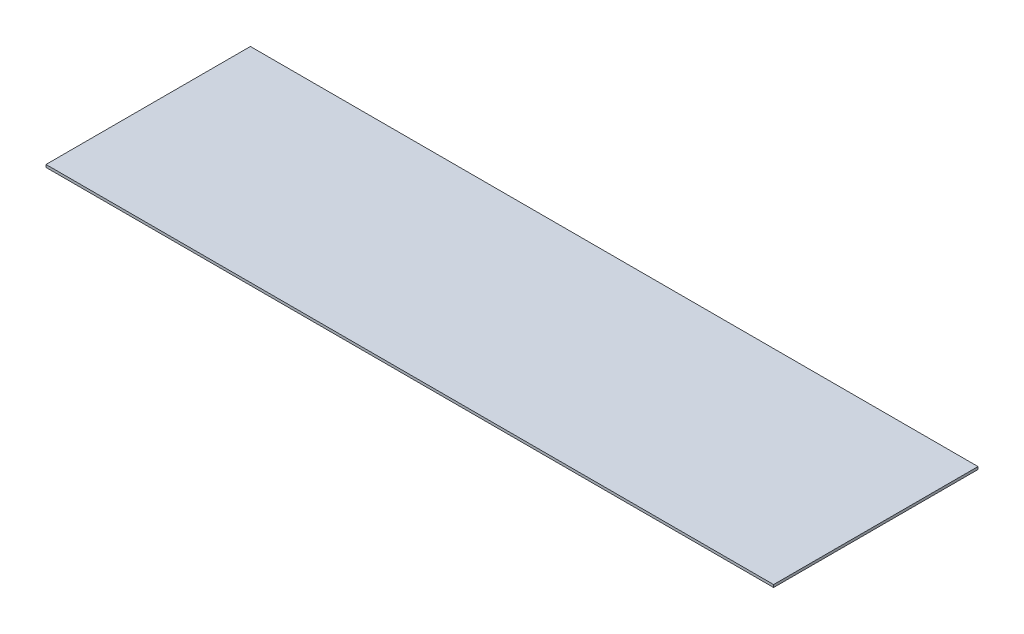
ISO-10303-21;
HEADER;
FILE_DESCRIPTION(('STEP AP214'),'2;1');
FILE_NAME('part.step','',(''),(''),'','','');
FILE_SCHEMA(('AUTOMOTIVE_DESIGN { 1 0 10303 214 1 1 1 1 }'));
ENDSEC;
DATA;
#1=APPLICATION_CONTEXT('core data for automotive mechanical design processes');
#2=APPLICATION_PROTOCOL_DEFINITION('international standard','automotive_design',2000,#1);
#3=PRODUCT_CONTEXT('',#1,'mechanical');
#4=PRODUCT('Part','Part','',(#3));
#5=PRODUCT_RELATED_PRODUCT_CATEGORY('part','',(#4));
#6=PRODUCT_DEFINITION_FORMATION('','',#4);
#7=PRODUCT_DEFINITION_CONTEXT('part definition',#1,'design');
#8=PRODUCT_DEFINITION('design','',#6,#7);
#9=PRODUCT_DEFINITION_SHAPE('','',#8);
#10=(LENGTH_UNIT() NAMED_UNIT(*) SI_UNIT(.MILLI.,.METRE.));
#11=(NAMED_UNIT(*) PLANE_ANGLE_UNIT() SI_UNIT($,.RADIAN.));
#12=(NAMED_UNIT(*) SI_UNIT($,.STERADIAN.) SOLID_ANGLE_UNIT());
#13=UNCERTAINTY_MEASURE_WITH_UNIT(LENGTH_MEASURE(1.E-05),#10,'distance_accuracy_value','');
#14=(GEOMETRIC_REPRESENTATION_CONTEXT(3) GLOBAL_UNCERTAINTY_ASSIGNED_CONTEXT((#13)) GLOBAL_UNIT_ASSIGNED_CONTEXT((#10,
#11,#12)) REPRESENTATION_CONTEXT('',''));
#15=CARTESIAN_POINT('',(0.,0.,0.));
#16=DIRECTION('',(0.,0.,1.));
#17=DIRECTION('',(1.,0.,0.));
#18=AXIS2_PLACEMENT_3D('',#15,#16,#17);
#19=CARTESIAN_POINT('',(0.,3.175,0.));
#20=DIRECTION('',(1.,0.,0.));
#21=DIRECTION('',(0.,0.,-1.));
#22=AXIS2_PLACEMENT_3D('',#19,#20,#21);
#23=PLANE('',#22);
#24=DIRECTION('',(0.,0.,1.));
#25=VECTOR('',#24,1.);
#26=CARTESIAN_POINT('',(0.,0.,0.));
#27=LINE('',#26,#25);
#28=CARTESIAN_POINT('',(0.,0.,-250.));
#29=VERTEX_POINT('',#28);
#30=CARTESIAN_POINT('',(0.,0.,0.));
#31=VERTEX_POINT('',#30);
#32=EDGE_CURVE('E102',#29,#31,#27,.T.);
#33=ORIENTED_EDGE('',*,*,#32,.T.);
#34=DIRECTION('',(0.,-1.,0.));
#35=VECTOR('',#34,1.);
#36=CARTESIAN_POINT('',(0.,3.175,0.));
#37=LINE('',#36,#35);
#38=CARTESIAN_POINT('',(0.,3.175,0.));
#39=VERTEX_POINT('',#38);
#40=EDGE_CURVE('E11',#39,#31,#37,.T.);
#41=ORIENTED_EDGE('',*,*,#40,.F.);
#42=DIRECTION('',(0.,0.,1.));
#43=VECTOR('',#42,1.);
#44=CARTESIAN_POINT('',(0.,3.175,0.));
#45=LINE('',#44,#43);
#46=CARTESIAN_POINT('',(0.,3.175,-250.));
#47=VERTEX_POINT('',#46);
#48=EDGE_CURVE('E90',#47,#39,#45,.T.);
#49=ORIENTED_EDGE('',*,*,#48,.F.);
#50=DIRECTION('',(0.,-1.,0.));
#51=VECTOR('',#50,1.);
#52=CARTESIAN_POINT('',(0.,3.175,-250.));
#53=LINE('',#52,#51);
#54=EDGE_CURVE('E98',#47,#29,#53,.T.);
#55=ORIENTED_EDGE('',*,*,#54,.T.);
#56=EDGE_LOOP('',(#33,#41,#49,#55));
#57=FACE_BOUND('',#56,.T.);
#58=ADVANCED_FACE('F39',(#57),#23,.F.);
#59=CARTESIAN_POINT('',(0.,3.175,0.));
#60=DIRECTION('',(0.,0.,-1.));
#61=DIRECTION('',(-1.,0.,0.));
#62=AXIS2_PLACEMENT_3D('',#59,#60,#61);
#63=PLANE('',#62);
#64=DIRECTION('',(1.,0.,0.));
#65=VECTOR('',#64,1.);
#66=CARTESIAN_POINT('',(0.,0.,0.));
#67=LINE('',#66,#65);
#68=CARTESIAN_POINT('',(890.,0.,0.));
#69=VERTEX_POINT('',#68);
#70=EDGE_CURVE('E94',#31,#69,#67,.T.);
#71=ORIENTED_EDGE('',*,*,#70,.T.);
#72=DIRECTION('',(0.,-1.,0.));
#73=VECTOR('',#72,1.);
#74=CARTESIAN_POINT('',(890.,3.175,0.));
#75=LINE('',#74,#73);
#76=CARTESIAN_POINT('',(890.,3.175,0.));
#77=VERTEX_POINT('',#76);
#78=EDGE_CURVE('E47',#77,#69,#75,.T.);
#79=ORIENTED_EDGE('',*,*,#78,.F.);
#80=DIRECTION('',(1.,0.,0.));
#81=VECTOR('',#80,1.);
#82=CARTESIAN_POINT('',(0.,3.175,0.));
#83=LINE('',#82,#81);
#84=EDGE_CURVE('E85',#39,#77,#83,.T.);
#85=ORIENTED_EDGE('',*,*,#84,.F.);
#86=ORIENTED_EDGE('',*,*,#40,.T.);
#87=EDGE_LOOP('',(#71,#79,#85,#86));
#88=FACE_BOUND('',#87,.T.);
#89=ADVANCED_FACE('F93',(#88),#63,.F.);
#90=CARTESIAN_POINT('',(890.,3.175,0.));
#91=DIRECTION('',(-1.,0.,0.));
#92=DIRECTION('',(0.,0.,1.));
#93=AXIS2_PLACEMENT_3D('',#90,#91,#92);
#94=PLANE('',#93);
#95=DIRECTION('',(0.,0.,-1.));
#96=VECTOR('',#95,1.);
#97=CARTESIAN_POINT('',(890.,0.,0.));
#98=LINE('',#97,#96);
#99=CARTESIAN_POINT('',(890.,0.,-250.));
#100=VERTEX_POINT('',#99);
#101=EDGE_CURVE('E72',#69,#100,#98,.T.);
#102=ORIENTED_EDGE('',*,*,#101,.T.);
#103=DIRECTION('',(0.,-1.,0.));
#104=VECTOR('',#103,1.);
#105=CARTESIAN_POINT('',(890.,3.175,-250.));
#106=LINE('',#105,#104);
#107=CARTESIAN_POINT('',(890.,3.175,-250.));
#108=VERTEX_POINT('',#107);
#109=EDGE_CURVE('E95',#108,#100,#106,.T.);
#110=ORIENTED_EDGE('',*,*,#109,.F.);
#111=DIRECTION('',(0.,0.,-1.));
#112=VECTOR('',#111,1.);
#113=CARTESIAN_POINT('',(890.,3.175,0.));
#114=LINE('',#113,#112);
#115=EDGE_CURVE('E88',#77,#108,#114,.T.);
#116=ORIENTED_EDGE('',*,*,#115,.F.);
#117=ORIENTED_EDGE('',*,*,#78,.T.);
#118=EDGE_LOOP('',(#102,#110,#116,#117));
#119=FACE_BOUND('',#118,.T.);
#120=ADVANCED_FACE('F96',(#119),#94,.F.);
#121=CARTESIAN_POINT('',(0.,3.175,-250.));
#122=DIRECTION('',(0.,0.,1.));
#123=DIRECTION('',(1.,0.,0.));
#124=AXIS2_PLACEMENT_3D('',#121,#122,#123);
#125=PLANE('',#124);
#126=DIRECTION('',(-1.,0.,0.));
#127=VECTOR('',#126,1.);
#128=CARTESIAN_POINT('',(0.,0.,-250.));
#129=LINE('',#128,#127);
#130=EDGE_CURVE('E78',#100,#29,#129,.T.);
#131=ORIENTED_EDGE('',*,*,#130,.T.);
#132=ORIENTED_EDGE('',*,*,#54,.F.);
#133=DIRECTION('',(-1.,0.,0.));
#134=VECTOR('',#133,1.);
#135=CARTESIAN_POINT('',(0.,3.175,-250.));
#136=LINE('',#135,#134);
#137=EDGE_CURVE('E55',#108,#47,#136,.T.);
#138=ORIENTED_EDGE('',*,*,#137,.F.);
#139=ORIENTED_EDGE('',*,*,#109,.T.);
#140=EDGE_LOOP('',(#131,#132,#138,#139));
#141=FACE_BOUND('',#140,.T.);
#142=ADVANCED_FACE('F109',(#141),#125,.F.);
#143=CARTESIAN_POINT('',(0.,3.175,0.));
#144=DIRECTION('',(0.,-1.,0.));
#145=DIRECTION('',(0.,0.,-1.));
#146=AXIS2_PLACEMENT_3D('',#143,#144,#145);
#147=PLANE('',#146);
#148=ORIENTED_EDGE('',*,*,#48,.T.);
#149=ORIENTED_EDGE('',*,*,#84,.T.);
#150=ORIENTED_EDGE('',*,*,#115,.T.);
#151=ORIENTED_EDGE('',*,*,#137,.T.);
#152=EDGE_LOOP('',(#148,#149,#150,#151));
#153=FACE_BOUND('',#152,.T.);
#154=ADVANCED_FACE('F86',(#153),#147,.F.);
#155=CARTESIAN_POINT('',(0.,0.,0.));
#156=DIRECTION('',(0.,-1.,0.));
#157=DIRECTION('',(0.,0.,-1.));
#158=AXIS2_PLACEMENT_3D('',#155,#156,#157);
#159=PLANE('',#158);
#160=ORIENTED_EDGE('',*,*,#32,.F.);
#161=ORIENTED_EDGE('',*,*,#130,.F.);
#162=ORIENTED_EDGE('',*,*,#101,.F.);
#163=ORIENTED_EDGE('',*,*,#70,.F.);
#164=EDGE_LOOP('',(#160,#161,#162,#163));
#165=FACE_BOUND('',#164,.T.);
#166=ADVANCED_FACE('F112',(#165),#159,.T.);
#167=CLOSED_SHELL('',(#58,#89,#120,#142,#154,#166));
#168=MANIFOLD_SOLID_BREP('B2',#167);
#169=ADVANCED_BREP_SHAPE_REPRESENTATION('',(#18,#168),#14);
#170=SHAPE_DEFINITION_REPRESENTATION(#9,#169);
ENDSEC;
END-ISO-10303-21;
